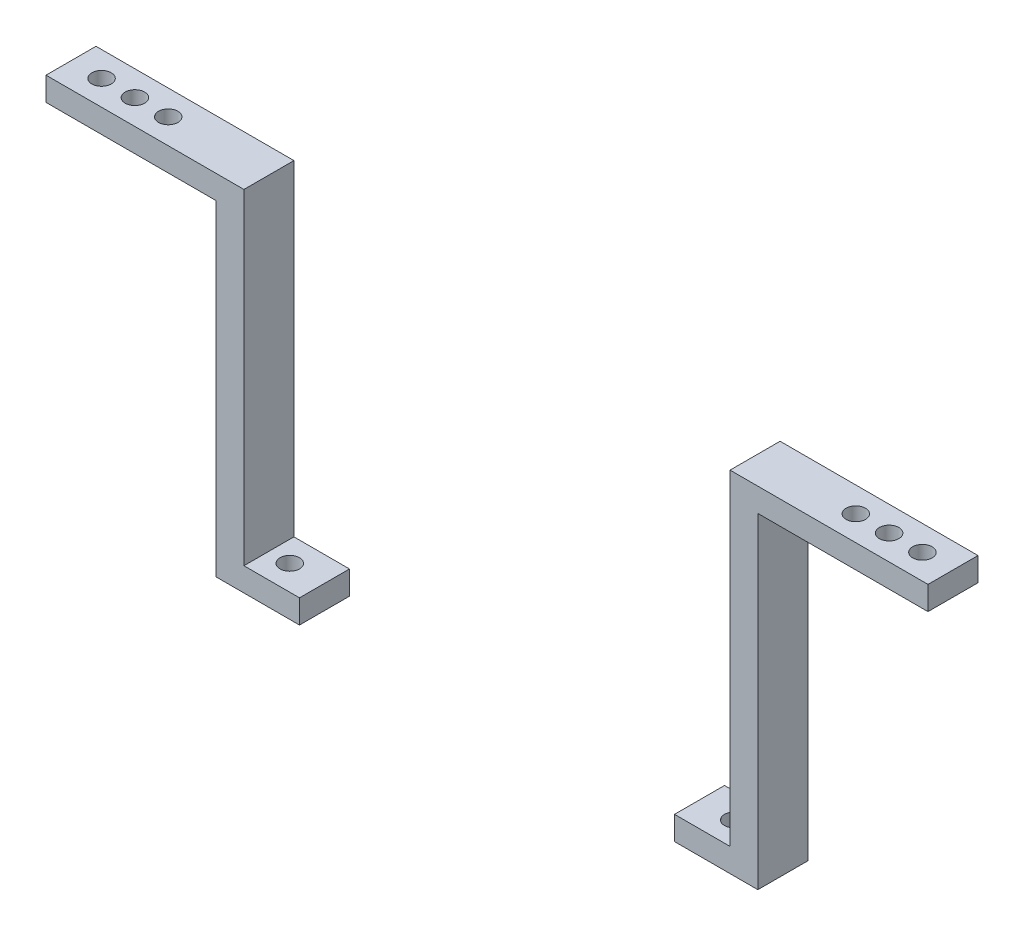
ISO-10303-21;
HEADER;
FILE_DESCRIPTION(('STEP AP214'),'2;1');
FILE_NAME('part.step','',(''),(''),'','','');
FILE_SCHEMA(('AUTOMOTIVE_DESIGN { 1 0 10303 214 1 1 1 1 }'));
ENDSEC;
DATA;
#1=APPLICATION_CONTEXT('core data for automotive mechanical design processes');
#2=APPLICATION_PROTOCOL_DEFINITION('international standard','automotive_design',2000,#1);
#3=PRODUCT_CONTEXT('',#1,'mechanical');
#4=PRODUCT('Part','Part','',(#3));
#5=PRODUCT_RELATED_PRODUCT_CATEGORY('part','',(#4));
#6=PRODUCT_DEFINITION_FORMATION('','',#4);
#7=PRODUCT_DEFINITION_CONTEXT('part definition',#1,'design');
#8=PRODUCT_DEFINITION('design','',#6,#7);
#9=PRODUCT_DEFINITION_SHAPE('','',#8);
#10=(LENGTH_UNIT() NAMED_UNIT(*) SI_UNIT(.MILLI.,.METRE.));
#11=(NAMED_UNIT(*) PLANE_ANGLE_UNIT() SI_UNIT($,.RADIAN.));
#12=(NAMED_UNIT(*) SI_UNIT($,.STERADIAN.) SOLID_ANGLE_UNIT());
#13=UNCERTAINTY_MEASURE_WITH_UNIT(LENGTH_MEASURE(1.E-05),#10,'distance_accuracy_value','');
#14=(GEOMETRIC_REPRESENTATION_CONTEXT(3) GLOBAL_UNCERTAINTY_ASSIGNED_CONTEXT((#13)) GLOBAL_UNIT_ASSIGNED_CONTEXT((#10,
#11,#12)) REPRESENTATION_CONTEXT('',''));
#15=CARTESIAN_POINT('',(0.,0.,0.));
#16=DIRECTION('',(0.,0.,1.));
#17=DIRECTION('',(1.,0.,0.));
#18=AXIS2_PLACEMENT_3D('',#15,#16,#17);
#19=CARTESIAN_POINT('',(0.,4.318,0.));
#20=DIRECTION('',(0.,1.,0.));
#21=DIRECTION('',(0.,0.,1.));
#22=AXIS2_PLACEMENT_3D('',#19,#20,#21);
#23=PLANE('',#22);
#24=DIRECTION('',(0.,0.,1.));
#25=VECTOR('',#24,1.);
#26=CARTESIAN_POINT('',(44.45,4.318,4.572));
#27=LINE('',#26,#25);
#28=CARTESIAN_POINT('',(44.45,4.318,-4.572));
#29=VERTEX_POINT('',#28);
#30=CARTESIAN_POINT('',(44.45,4.318,4.572));
#31=VERTEX_POINT('',#30);
#32=EDGE_CURVE('E60',#29,#31,#27,.T.);
#33=ORIENTED_EDGE('',*,*,#32,.F.);
#34=DIRECTION('',(-1.,0.,0.));
#35=VECTOR('',#34,1.);
#36=CARTESIAN_POINT('',(34.29,4.318,-4.572));
#37=LINE('',#36,#35);
#38=CARTESIAN_POINT('',(34.29,4.318,-4.572));
#39=VERTEX_POINT('',#38);
#40=EDGE_CURVE('E65',#29,#39,#37,.T.);
#41=ORIENTED_EDGE('',*,*,#40,.T.);
#42=DIRECTION('',(0.,0.,1.));
#43=VECTOR('',#42,1.);
#44=CARTESIAN_POINT('',(34.29,4.318,-4.572));
#45=LINE('',#44,#43);
#46=CARTESIAN_POINT('',(34.29,4.318,4.572));
#47=VERTEX_POINT('',#46);
#48=EDGE_CURVE('E96',#39,#47,#45,.T.);
#49=ORIENTED_EDGE('',*,*,#48,.T.);
#50=DIRECTION('',(1.,0.,0.));
#51=VECTOR('',#50,1.);
#52=CARTESIAN_POINT('',(34.29,4.318,4.572));
#53=LINE('',#52,#51);
#54=EDGE_CURVE('E118',#47,#31,#53,.T.);
#55=ORIENTED_EDGE('',*,*,#54,.T.);
#56=EDGE_LOOP('',(#33,#41,#49,#55));
#57=FACE_BOUND('',#56,.T.);
#58=CARTESIAN_POINT('',(40.64,4.318,0.));
#59=DIRECTION('',(0.,1.,0.));
#60=DIRECTION('',(0.,0.,1.));
#61=AXIS2_PLACEMENT_3D('',#58,#59,#60);
#62=CIRCLE('',#61,1.778);
#63=CARTESIAN_POINT('',(40.64,4.318,1.778));
#64=VERTEX_POINT('',#63);
#65=EDGE_CURVE('E107',#64,#64,#62,.T.);
#66=ORIENTED_EDGE('',*,*,#65,.F.);
#67=EDGE_LOOP('',(#66));
#68=FACE_BOUND('',#67,.T.);
#69=ADVANCED_FACE('F43',(#57,#68),#23,.T.);
#70=CARTESIAN_POINT('',(0.,0.,0.));
#71=DIRECTION('',(0.,1.,0.));
#72=DIRECTION('',(0.,0.,1.));
#73=AXIS2_PLACEMENT_3D('',#70,#71,#72);
#74=PLANE('',#73);
#75=DIRECTION('',(0.,0.,1.));
#76=VECTOR('',#75,1.);
#77=CARTESIAN_POINT('',(34.29,0.,-4.572));
#78=LINE('',#77,#76);
#79=CARTESIAN_POINT('',(34.29,0.,-4.572));
#80=VERTEX_POINT('',#79);
#81=CARTESIAN_POINT('',(34.29,0.,4.572));
#82=VERTEX_POINT('',#81);
#83=EDGE_CURVE('E102',#80,#82,#78,.T.);
#84=ORIENTED_EDGE('',*,*,#83,.F.);
#85=DIRECTION('',(-1.,0.,0.));
#86=VECTOR('',#85,1.);
#87=CARTESIAN_POINT('',(34.29,0.,-4.572));
#88=LINE('',#87,#86);
#89=CARTESIAN_POINT('',(49.53,0.,-4.572));
#90=VERTEX_POINT('',#89);
#91=EDGE_CURVE('E85',#90,#80,#88,.T.);
#92=ORIENTED_EDGE('',*,*,#91,.F.);
#93=DIRECTION('',(0.,0.,-1.));
#94=VECTOR('',#93,1.);
#95=CARTESIAN_POINT('',(49.53,0.,-4.572));
#96=LINE('',#95,#94);
#97=CARTESIAN_POINT('',(49.53,0.,4.572));
#98=VERTEX_POINT('',#97);
#99=EDGE_CURVE('E97',#98,#90,#96,.T.);
#100=ORIENTED_EDGE('',*,*,#99,.F.);
#101=DIRECTION('',(1.,0.,0.));
#102=VECTOR('',#101,1.);
#103=CARTESIAN_POINT('',(34.29,0.,4.572));
#104=LINE('',#103,#102);
#105=EDGE_CURVE('E106',#82,#98,#104,.T.);
#106=ORIENTED_EDGE('',*,*,#105,.F.);
#107=EDGE_LOOP('',(#84,#92,#100,#106));
#108=FACE_BOUND('',#107,.T.);
#109=CARTESIAN_POINT('',(40.64,0.,0.));
#110=DIRECTION('',(0.,1.,0.));
#111=DIRECTION('',(0.,0.,1.));
#112=AXIS2_PLACEMENT_3D('',#109,#110,#111);
#113=CIRCLE('',#112,1.778);
#114=CARTESIAN_POINT('',(40.64,0.,1.778));
#115=VERTEX_POINT('',#114);
#116=EDGE_CURVE('E111',#115,#115,#113,.T.);
#117=ORIENTED_EDGE('',*,*,#116,.T.);
#118=EDGE_LOOP('',(#117));
#119=FACE_BOUND('',#118,.T.);
#120=ADVANCED_FACE('F104',(#108,#119),#74,.F.);
#121=CARTESIAN_POINT('',(34.29,4.318,-4.572));
#122=DIRECTION('',(1.,0.,0.));
#123=DIRECTION('',(0.,0.,-1.));
#124=AXIS2_PLACEMENT_3D('',#121,#122,#123);
#125=PLANE('',#124);
#126=ORIENTED_EDGE('',*,*,#83,.T.);
#127=DIRECTION('',(0.,-1.,0.));
#128=VECTOR('',#127,1.);
#129=CARTESIAN_POINT('',(34.29,4.318,4.572));
#130=LINE('',#129,#128);
#131=EDGE_CURVE('E12',#47,#82,#130,.T.);
#132=ORIENTED_EDGE('',*,*,#131,.F.);
#133=ORIENTED_EDGE('',*,*,#48,.F.);
#134=DIRECTION('',(0.,-1.,0.));
#135=VECTOR('',#134,1.);
#136=CARTESIAN_POINT('',(34.29,4.318,-4.572));
#137=LINE('',#136,#135);
#138=EDGE_CURVE('E88',#39,#80,#137,.T.);
#139=ORIENTED_EDGE('',*,*,#138,.T.);
#140=EDGE_LOOP('',(#126,#132,#133,#139));
#141=FACE_BOUND('',#140,.T.);
#142=ADVANCED_FACE('F45',(#141),#125,.F.);
#143=CARTESIAN_POINT('',(34.29,4.318,4.572));
#144=DIRECTION('',(0.,0.,-1.));
#145=DIRECTION('',(-1.,0.,0.));
#146=AXIS2_PLACEMENT_3D('',#143,#144,#145);
#147=PLANE('',#146);
#148=ORIENTED_EDGE('',*,*,#105,.T.);
#149=DIRECTION('',(0.,-1.,0.));
#150=VECTOR('',#149,1.);
#151=CARTESIAN_POINT('',(49.53,4.318,4.572));
#152=LINE('',#151,#150);
#153=CARTESIAN_POINT('',(49.53,59.594,4.572));
#154=VERTEX_POINT('',#153);
#155=EDGE_CURVE('E52',#154,#98,#152,.T.);
#156=ORIENTED_EDGE('',*,*,#155,.F.);
#157=DIRECTION('',(1.,0.,0.));
#158=VECTOR('',#157,1.);
#159=CARTESIAN_POINT('',(44.45,59.594,4.572));
#160=LINE('',#159,#158);
#161=CARTESIAN_POINT('',(80.645,59.594,4.57199999999999));
#162=VERTEX_POINT('',#161);
#163=EDGE_CURVE('E154',#154,#162,#160,.T.);
#164=ORIENTED_EDGE('',*,*,#163,.T.);
#165=DIRECTION('',(0.,-1.,0.));
#166=VECTOR('',#165,1.);
#167=CARTESIAN_POINT('',(80.645,63.912,4.57199999999999));
#168=LINE('',#167,#166);
#169=CARTESIAN_POINT('',(80.645,63.912,4.57199999999999));
#170=VERTEX_POINT('',#169);
#171=EDGE_CURVE('E133',#170,#162,#168,.T.);
#172=ORIENTED_EDGE('',*,*,#171,.F.);
#173=DIRECTION('',(1.,0.,0.));
#174=VECTOR('',#173,1.);
#175=CARTESIAN_POINT('',(44.45,63.912,4.572));
#176=LINE('',#175,#174);
#177=CARTESIAN_POINT('',(44.45,63.912,4.572));
#178=VERTEX_POINT('',#177);
#179=EDGE_CURVE('E175',#178,#170,#176,.T.);
#180=ORIENTED_EDGE('',*,*,#179,.F.);
#181=DIRECTION('',(0.,-1.,0.));
#182=VECTOR('',#181,1.);
#183=CARTESIAN_POINT('',(44.45,59.594,4.572));
#184=LINE('',#183,#182);
#185=EDGE_CURVE('E134',#178,#31,#184,.T.);
#186=ORIENTED_EDGE('',*,*,#185,.T.);
#187=ORIENTED_EDGE('',*,*,#54,.F.);
#188=ORIENTED_EDGE('',*,*,#131,.T.);
#189=EDGE_LOOP('',(#148,#156,#164,#172,#180,#186,#187,#188));
#190=FACE_BOUND('',#189,.T.);
#191=ADVANCED_FACE('F228',(#190),#147,.F.);
#192=CARTESIAN_POINT('',(49.53,4.318,-4.572));
#193=DIRECTION('',(-1.,0.,0.));
#194=DIRECTION('',(0.,0.,1.));
#195=AXIS2_PLACEMENT_3D('',#192,#193,#194);
#196=PLANE('',#195);
#197=ORIENTED_EDGE('',*,*,#99,.T.);
#198=DIRECTION('',(0.,-1.,0.));
#199=VECTOR('',#198,1.);
#200=CARTESIAN_POINT('',(49.53,4.318,-4.572));
#201=LINE('',#200,#199);
#202=CARTESIAN_POINT('',(49.53,59.594,-4.572));
#203=VERTEX_POINT('',#202);
#204=EDGE_CURVE('E92',#203,#90,#201,.T.);
#205=ORIENTED_EDGE('',*,*,#204,.F.);
#206=DIRECTION('',(0.,0.,-1.));
#207=VECTOR('',#206,1.);
#208=CARTESIAN_POINT('',(49.53,59.594,4.572));
#209=LINE('',#208,#207);
#210=EDGE_CURVE('E132',#154,#203,#209,.T.);
#211=ORIENTED_EDGE('',*,*,#210,.F.);
#212=ORIENTED_EDGE('',*,*,#155,.T.);
#213=EDGE_LOOP('',(#197,#205,#211,#212));
#214=FACE_BOUND('',#213,.T.);
#215=ADVANCED_FACE('F229',(#214),#196,.F.);
#216=CARTESIAN_POINT('',(34.29,4.318,-4.572));
#217=DIRECTION('',(0.,0.,1.));
#218=DIRECTION('',(1.,0.,0.));
#219=AXIS2_PLACEMENT_3D('',#216,#217,#218);
#220=PLANE('',#219);
#221=ORIENTED_EDGE('',*,*,#91,.T.);
#222=ORIENTED_EDGE('',*,*,#138,.F.);
#223=ORIENTED_EDGE('',*,*,#40,.F.);
#224=DIRECTION('',(0.,-1.,0.));
#225=VECTOR('',#224,1.);
#226=CARTESIAN_POINT('',(44.45,59.594,-4.572));
#227=LINE('',#226,#225);
#228=CARTESIAN_POINT('',(44.45,63.912,-4.572));
#229=VERTEX_POINT('',#228);
#230=EDGE_CURVE('E125',#229,#29,#227,.T.);
#231=ORIENTED_EDGE('',*,*,#230,.F.);
#232=DIRECTION('',(-1.,0.,0.));
#233=VECTOR('',#232,1.);
#234=CARTESIAN_POINT('',(44.45,63.912,-4.572));
#235=LINE('',#234,#233);
#236=CARTESIAN_POINT('',(80.645,63.912,-4.57200000000001));
#237=VERTEX_POINT('',#236);
#238=EDGE_CURVE('E182',#237,#229,#235,.T.);
#239=ORIENTED_EDGE('',*,*,#238,.F.);
#240=DIRECTION('',(0.,-1.,0.));
#241=VECTOR('',#240,1.);
#242=CARTESIAN_POINT('',(80.645,63.912,-4.57200000000001));
#243=LINE('',#242,#241);
#244=CARTESIAN_POINT('',(80.645,59.594,-4.57200000000001));
#245=VERTEX_POINT('',#244);
#246=EDGE_CURVE('E185',#237,#245,#243,.T.);
#247=ORIENTED_EDGE('',*,*,#246,.T.);
#248=DIRECTION('',(-1.,0.,0.));
#249=VECTOR('',#248,1.);
#250=CARTESIAN_POINT('',(44.45,59.594,-4.572));
#251=LINE('',#250,#249);
#252=EDGE_CURVE('E176',#245,#203,#251,.T.);
#253=ORIENTED_EDGE('',*,*,#252,.T.);
#254=ORIENTED_EDGE('',*,*,#204,.T.);
#255=EDGE_LOOP('',(#221,#222,#223,#231,#239,#247,#253,#254));
#256=FACE_BOUND('',#255,.T.);
#257=ADVANCED_FACE('F87',(#256),#220,.F.);
#258=CARTESIAN_POINT('',(40.64,4.318,0.));
#259=DIRECTION('',(0.,-1.,0.));
#260=DIRECTION('',(0.,0.,-1.));
#261=AXIS2_PLACEMENT_3D('',#258,#259,#260);
#262=CYLINDRICAL_SURFACE('',#261,1.778);
#263=ORIENTED_EDGE('',*,*,#65,.T.);
#264=EDGE_LOOP('',(#263));
#265=FACE_BOUND('',#264,.T.);
#266=ORIENTED_EDGE('',*,*,#116,.F.);
#267=EDGE_LOOP('',(#266));
#268=FACE_BOUND('',#267,.T.);
#269=ADVANCED_FACE('F236',(#265,#268),#262,.F.);
#270=CARTESIAN_POINT('',(44.45,59.594,4.572));
#271=DIRECTION('',(1.,0.,0.));
#272=DIRECTION('',(0.,0.,-1.));
#273=AXIS2_PLACEMENT_3D('',#270,#271,#272);
#274=PLANE('',#273);
#275=ORIENTED_EDGE('',*,*,#32,.T.);
#276=ORIENTED_EDGE('',*,*,#185,.F.);
#277=DIRECTION('',(0.,0.,1.));
#278=VECTOR('',#277,1.);
#279=CARTESIAN_POINT('',(44.45,63.912,4.572));
#280=LINE('',#279,#278);
#281=EDGE_CURVE('E172',#229,#178,#280,.T.);
#282=ORIENTED_EDGE('',*,*,#281,.F.);
#283=ORIENTED_EDGE('',*,*,#230,.T.);
#284=EDGE_LOOP('',(#275,#276,#282,#283));
#285=FACE_BOUND('',#284,.T.);
#286=ADVANCED_FACE('F248',(#285),#274,.F.);
#287=CARTESIAN_POINT('',(80.645,63.912,4.57199999999999));
#288=DIRECTION('',(-1.,0.,0.));
#289=DIRECTION('',(0.,0.,1.));
#290=AXIS2_PLACEMENT_3D('',#287,#288,#289);
#291=PLANE('',#290);
#292=DIRECTION('',(0.,0.,-1.));
#293=VECTOR('',#292,1.);
#294=CARTESIAN_POINT('',(80.645,59.594,4.57199999999999));
#295=LINE('',#294,#293);
#296=EDGE_CURVE('E188',#162,#245,#295,.T.);
#297=ORIENTED_EDGE('',*,*,#296,.T.);
#298=ORIENTED_EDGE('',*,*,#246,.F.);
#299=DIRECTION('',(0.,0.,-1.));
#300=VECTOR('',#299,1.);
#301=CARTESIAN_POINT('',(80.645,63.912,4.57199999999999));
#302=LINE('',#301,#300);
#303=EDGE_CURVE('E179',#170,#237,#302,.T.);
#304=ORIENTED_EDGE('',*,*,#303,.F.);
#305=ORIENTED_EDGE('',*,*,#171,.T.);
#306=EDGE_LOOP('',(#297,#298,#304,#305));
#307=FACE_BOUND('',#306,.T.);
#308=ADVANCED_FACE('F207',(#307),#291,.F.);
#309=CARTESIAN_POINT('',(0.,63.912,0.));
#310=DIRECTION('',(0.,-1.,0.));
#311=DIRECTION('',(0.,0.,-1.));
#312=AXIS2_PLACEMENT_3D('',#309,#310,#311);
#313=PLANE('',#312);
#314=CARTESIAN_POINT('',(62.865,63.912,0.));
#315=DIRECTION('',(0.,1.,0.));
#316=DIRECTION('',(0.,0.,1.));
#317=AXIS2_PLACEMENT_3D('',#314,#315,#316);
#318=CIRCLE('',#317,1.77800000000001);
#319=CARTESIAN_POINT('',(62.865,63.912,1.77800000000001));
#320=VERTEX_POINT('',#319);
#321=EDGE_CURVE('E158',#320,#320,#318,.T.);
#322=ORIENTED_EDGE('',*,*,#321,.F.);
#323=EDGE_LOOP('',(#322));
#324=FACE_BOUND('',#323,.T.);
#325=CARTESIAN_POINT('',(68.961,63.912,0.));
#326=DIRECTION('',(0.,1.,0.));
#327=DIRECTION('',(0.,0.,1.));
#328=AXIS2_PLACEMENT_3D('',#325,#326,#327);
#329=CIRCLE('',#328,1.77800000000001);
#330=CARTESIAN_POINT('',(68.961,63.912,1.77800000000001));
#331=VERTEX_POINT('',#330);
#332=EDGE_CURVE('E163',#331,#331,#329,.T.);
#333=ORIENTED_EDGE('',*,*,#332,.F.);
#334=EDGE_LOOP('',(#333));
#335=FACE_BOUND('',#334,.T.);
#336=CARTESIAN_POINT('',(75.057,63.912,0.));
#337=DIRECTION('',(0.,1.,0.));
#338=DIRECTION('',(0.,0.,1.));
#339=AXIS2_PLACEMENT_3D('',#336,#337,#338);
#340=CIRCLE('',#339,1.77800000000001);
#341=CARTESIAN_POINT('',(75.057,63.912,1.77800000000001));
#342=VERTEX_POINT('',#341);
#343=EDGE_CURVE('E155',#342,#342,#340,.T.);
#344=ORIENTED_EDGE('',*,*,#343,.F.);
#345=EDGE_LOOP('',(#344));
#346=FACE_BOUND('',#345,.T.);
#347=ORIENTED_EDGE('',*,*,#281,.T.);
#348=ORIENTED_EDGE('',*,*,#179,.T.);
#349=ORIENTED_EDGE('',*,*,#303,.T.);
#350=ORIENTED_EDGE('',*,*,#238,.T.);
#351=EDGE_LOOP('',(#347,#348,#349,#350));
#352=FACE_BOUND('',#351,.T.);
#353=ADVANCED_FACE('F255',(#324,#335,#346,#352),#313,.F.);
#354=CARTESIAN_POINT('',(0.,59.594,0.));
#355=DIRECTION('',(0.,-1.,0.));
#356=DIRECTION('',(0.,0.,-1.));
#357=AXIS2_PLACEMENT_3D('',#354,#355,#356);
#358=PLANE('',#357);
#359=CARTESIAN_POINT('',(62.865,59.594,0.));
#360=DIRECTION('',(0.,-1.,0.));
#361=DIRECTION('',(0.,0.,-1.));
#362=AXIS2_PLACEMENT_3D('',#359,#360,#361);
#363=CIRCLE('',#362,1.77800000000001);
#364=CARTESIAN_POINT('',(62.865,59.594,-1.77800000000001));
#365=VERTEX_POINT('',#364);
#366=EDGE_CURVE('E47',#365,#365,#363,.T.);
#367=ORIENTED_EDGE('',*,*,#366,.F.);
#368=EDGE_LOOP('',(#367));
#369=FACE_BOUND('',#368,.T.);
#370=CARTESIAN_POINT('',(68.961,59.594,0.));
#371=DIRECTION('',(0.,-1.,0.));
#372=DIRECTION('',(0.,0.,-1.));
#373=AXIS2_PLACEMENT_3D('',#370,#371,#372);
#374=CIRCLE('',#373,1.77800000000001);
#375=CARTESIAN_POINT('',(68.961,59.594,-1.77800000000001));
#376=VERTEX_POINT('',#375);
#377=EDGE_CURVE('E156',#376,#376,#374,.T.);
#378=ORIENTED_EDGE('',*,*,#377,.F.);
#379=EDGE_LOOP('',(#378));
#380=FACE_BOUND('',#379,.T.);
#381=CARTESIAN_POINT('',(75.057,59.594,0.));
#382=DIRECTION('',(0.,-1.,0.));
#383=DIRECTION('',(0.,0.,-1.));
#384=AXIS2_PLACEMENT_3D('',#381,#382,#383);
#385=CIRCLE('',#384,1.77800000000001);
#386=CARTESIAN_POINT('',(75.057,59.594,-1.77800000000001));
#387=VERTEX_POINT('',#386);
#388=EDGE_CURVE('E152',#387,#387,#385,.T.);
#389=ORIENTED_EDGE('',*,*,#388,.F.);
#390=EDGE_LOOP('',(#389));
#391=FACE_BOUND('',#390,.T.);
#392=ORIENTED_EDGE('',*,*,#163,.F.);
#393=ORIENTED_EDGE('',*,*,#210,.T.);
#394=ORIENTED_EDGE('',*,*,#252,.F.);
#395=ORIENTED_EDGE('',*,*,#296,.F.);
#396=EDGE_LOOP('',(#392,#393,#394,#395));
#397=FACE_BOUND('',#396,.T.);
#398=ADVANCED_FACE('F214',(#369,#380,#391,#397),#358,.T.);
#399=CARTESIAN_POINT('',(75.057,-2.50000000007189E-05,0.));
#400=DIRECTION('',(0.,1.,0.));
#401=DIRECTION('',(0.,0.,1.));
#402=AXIS2_PLACEMENT_3D('',#399,#400,#401);
#403=CYLINDRICAL_SURFACE('',#402,1.77800000000001);
#404=ORIENTED_EDGE('',*,*,#388,.T.);
#405=EDGE_LOOP('',(#404));
#406=FACE_BOUND('',#405,.T.);
#407=ORIENTED_EDGE('',*,*,#343,.T.);
#408=EDGE_LOOP('',(#407));
#409=FACE_BOUND('',#408,.T.);
#410=ADVANCED_FACE('F258',(#406,#409),#403,.F.);
#411=CARTESIAN_POINT('',(68.961,-2.50000000007189E-05,0.));
#412=DIRECTION('',(0.,1.,0.));
#413=DIRECTION('',(0.,0.,1.));
#414=AXIS2_PLACEMENT_3D('',#411,#412,#413);
#415=CYLINDRICAL_SURFACE('',#414,1.77800000000001);
#416=ORIENTED_EDGE('',*,*,#377,.T.);
#417=EDGE_LOOP('',(#416));
#418=FACE_BOUND('',#417,.T.);
#419=ORIENTED_EDGE('',*,*,#332,.T.);
#420=EDGE_LOOP('',(#419));
#421=FACE_BOUND('',#420,.T.);
#422=ADVANCED_FACE('F265',(#418,#421),#415,.F.);
#423=CARTESIAN_POINT('',(62.865,-2.50000000007189E-05,0.));
#424=DIRECTION('',(0.,1.,0.));
#425=DIRECTION('',(0.,0.,1.));
#426=AXIS2_PLACEMENT_3D('',#423,#424,#425);
#427=CYLINDRICAL_SURFACE('',#426,1.77800000000001);
#428=ORIENTED_EDGE('',*,*,#366,.T.);
#429=EDGE_LOOP('',(#428));
#430=FACE_BOUND('',#429,.T.);
#431=ORIENTED_EDGE('',*,*,#321,.T.);
#432=EDGE_LOOP('',(#431));
#433=FACE_BOUND('',#432,.T.);
#434=ADVANCED_FACE('F269',(#430,#433),#427,.F.);
#435=CLOSED_SHELL('',(#69,#120,#142,#191,#215,#257,#269,#286,#308,#353,#398,#410,#422,#434));
#436=MANIFOLD_SOLID_BREP('B2',#435);
#437=CARTESIAN_POINT('',(0.,4.318,0.));
#438=DIRECTION('',(0.,1.,0.));
#439=DIRECTION('',(0.,0.,1.));
#440=AXIS2_PLACEMENT_3D('',#437,#438,#439);
#441=PLANE('',#440);
#442=DIRECTION('',(0.,0.,-1.));
#443=VECTOR('',#442,1.);
#444=CARTESIAN_POINT('',(-44.45,4.318,-4.572));
#445=LINE('',#444,#443);
#446=CARTESIAN_POINT('',(-44.45,4.318,4.572));
#447=VERTEX_POINT('',#446);
#448=CARTESIAN_POINT('',(-44.45,4.318,-4.572));
#449=VERTEX_POINT('',#448);
#450=EDGE_CURVE('E410',#447,#449,#445,.T.);
#451=ORIENTED_EDGE('',*,*,#450,.F.);
#452=DIRECTION('',(1.,0.,0.));
#453=VECTOR('',#452,1.);
#454=CARTESIAN_POINT('',(-49.53,4.318,4.572));
#455=LINE('',#454,#453);
#456=CARTESIAN_POINT('',(-34.29,4.318,4.572));
#457=VERTEX_POINT('',#456);
#458=EDGE_CURVE('E447',#447,#457,#455,.T.);
#459=ORIENTED_EDGE('',*,*,#458,.T.);
#460=DIRECTION('',(0.,0.,-1.));
#461=VECTOR('',#460,1.);
#462=CARTESIAN_POINT('',(-34.29,4.318,-4.572));
#463=LINE('',#462,#461);
#464=CARTESIAN_POINT('',(-34.29,4.318,-4.572));
#465=VERTEX_POINT('',#464);
#466=EDGE_CURVE('E416',#457,#465,#463,.T.);
#467=ORIENTED_EDGE('',*,*,#466,.T.);
#468=DIRECTION('',(-1.,0.,0.));
#469=VECTOR('',#468,1.);
#470=CARTESIAN_POINT('',(-49.53,4.318,-4.572));
#471=LINE('',#470,#469);
#472=EDGE_CURVE('E457',#465,#449,#471,.T.);
#473=ORIENTED_EDGE('',*,*,#472,.T.);
#474=EDGE_LOOP('',(#451,#459,#467,#473));
#475=FACE_BOUND('',#474,.T.);
#476=CARTESIAN_POINT('',(-40.64,4.318,0.));
#477=DIRECTION('',(0.,1.,0.));
#478=DIRECTION('',(0.,0.,1.));
#479=AXIS2_PLACEMENT_3D('',#476,#477,#478);
#480=CIRCLE('',#479,1.778);
#481=CARTESIAN_POINT('',(-40.64,4.318,1.778));
#482=VERTEX_POINT('',#481);
#483=EDGE_CURVE('E461',#482,#482,#480,.T.);
#484=ORIENTED_EDGE('',*,*,#483,.F.);
#485=EDGE_LOOP('',(#484));
#486=FACE_BOUND('',#485,.T.);
#487=ADVANCED_FACE('F393',(#475,#486),#441,.T.);
#488=CARTESIAN_POINT('',(0.,0.,0.));
#489=DIRECTION('',(0.,1.,0.));
#490=DIRECTION('',(0.,0.,1.));
#491=AXIS2_PLACEMENT_3D('',#488,#489,#490);
#492=PLANE('',#491);
#493=DIRECTION('',(0.,0.,1.));
#494=VECTOR('',#493,1.);
#495=CARTESIAN_POINT('',(-49.53,0.,-4.572));
#496=LINE('',#495,#494);
#497=CARTESIAN_POINT('',(-49.53,0.,-4.572));
#498=VERTEX_POINT('',#497);
#499=CARTESIAN_POINT('',(-49.53,0.,4.572));
#500=VERTEX_POINT('',#499);
#501=EDGE_CURVE('E453',#498,#500,#496,.T.);
#502=ORIENTED_EDGE('',*,*,#501,.F.);
#503=DIRECTION('',(-1.,0.,0.));
#504=VECTOR('',#503,1.);
#505=CARTESIAN_POINT('',(-49.53,0.,-4.572));
#506=LINE('',#505,#504);
#507=CARTESIAN_POINT('',(-34.29,0.,-4.572));
#508=VERTEX_POINT('',#507);
#509=EDGE_CURVE('E436',#508,#498,#506,.T.);
#510=ORIENTED_EDGE('',*,*,#509,.F.);
#511=DIRECTION('',(0.,0.,-1.));
#512=VECTOR('',#511,1.);
#513=CARTESIAN_POINT('',(-34.29,0.,-4.572));
#514=LINE('',#513,#512);
#515=CARTESIAN_POINT('',(-34.29,0.,4.572));
#516=VERTEX_POINT('',#515);
#517=EDGE_CURVE('E448',#516,#508,#514,.T.);
#518=ORIENTED_EDGE('',*,*,#517,.F.);
#519=DIRECTION('',(1.,0.,0.));
#520=VECTOR('',#519,1.);
#521=CARTESIAN_POINT('',(-49.53,0.,4.572));
#522=LINE('',#521,#520);
#523=EDGE_CURVE('E460',#500,#516,#522,.T.);
#524=ORIENTED_EDGE('',*,*,#523,.F.);
#525=EDGE_LOOP('',(#502,#510,#518,#524));
#526=FACE_BOUND('',#525,.T.);
#527=CARTESIAN_POINT('',(-40.64,0.,0.));
#528=DIRECTION('',(0.,1.,0.));
#529=DIRECTION('',(0.,0.,1.));
#530=AXIS2_PLACEMENT_3D('',#527,#528,#529);
#531=CIRCLE('',#530,1.778);
#532=CARTESIAN_POINT('',(-40.64,0.,1.778));
#533=VERTEX_POINT('',#532);
#534=EDGE_CURVE('E465',#533,#533,#531,.T.);
#535=ORIENTED_EDGE('',*,*,#534,.T.);
#536=EDGE_LOOP('',(#535));
#537=FACE_BOUND('',#536,.T.);
#538=ADVANCED_FACE('F458',(#526,#537),#492,.F.);
#539=CARTESIAN_POINT('',(-49.53,4.318,-4.572));
#540=DIRECTION('',(1.,0.,0.));
#541=DIRECTION('',(0.,0.,-1.));
#542=AXIS2_PLACEMENT_3D('',#539,#540,#541);
#543=PLANE('',#542);
#544=ORIENTED_EDGE('',*,*,#501,.T.);
#545=DIRECTION('',(0.,-1.,0.));
#546=VECTOR('',#545,1.);
#547=CARTESIAN_POINT('',(-49.53,4.318,4.572));
#548=LINE('',#547,#546);
#549=CARTESIAN_POINT('',(-49.53,59.594,4.572));
#550=VERTEX_POINT('',#549);
#551=EDGE_CURVE('E41',#550,#500,#548,.T.);
#552=ORIENTED_EDGE('',*,*,#551,.F.);
#553=DIRECTION('',(0.,0.,1.));
#554=VECTOR('',#553,1.);
#555=CARTESIAN_POINT('',(-49.53,59.594,-4.572));
#556=LINE('',#555,#554);
#557=CARTESIAN_POINT('',(-49.53,59.594,-4.572));
#558=VERTEX_POINT('',#557);
#559=EDGE_CURVE('E455',#558,#550,#556,.T.);
#560=ORIENTED_EDGE('',*,*,#559,.F.);
#561=DIRECTION('',(0.,-1.,0.));
#562=VECTOR('',#561,1.);
#563=CARTESIAN_POINT('',(-49.53,4.318,-4.572));
#564=LINE('',#563,#562);
#565=EDGE_CURVE('E440',#558,#498,#564,.T.);
#566=ORIENTED_EDGE('',*,*,#565,.T.);
#567=EDGE_LOOP('',(#544,#552,#560,#566));
#568=FACE_BOUND('',#567,.T.);
#569=ADVANCED_FACE('F395',(#568),#543,.F.);
#570=CARTESIAN_POINT('',(-49.53,4.318,4.572));
#571=DIRECTION('',(0.,0.,-1.));
#572=DIRECTION('',(-1.,0.,0.));
#573=AXIS2_PLACEMENT_3D('',#570,#571,#572);
#574=PLANE('',#573);
#575=ORIENTED_EDGE('',*,*,#523,.T.);
#576=DIRECTION('',(0.,-1.,0.));
#577=VECTOR('',#576,1.);
#578=CARTESIAN_POINT('',(-34.29,4.318,4.572));
#579=LINE('',#578,#577);
#580=EDGE_CURVE('E402',#457,#516,#579,.T.);
#581=ORIENTED_EDGE('',*,*,#580,.F.);
#582=ORIENTED_EDGE('',*,*,#458,.F.);
#583=DIRECTION('',(0.,-1.,0.));
#584=VECTOR('',#583,1.);
#585=CARTESIAN_POINT('',(-44.45,59.594,4.572));
#586=LINE('',#585,#584);
#587=CARTESIAN_POINT('',(-44.45,63.912,4.572));
#588=VERTEX_POINT('',#587);
#589=EDGE_CURVE('E493',#588,#447,#586,.T.);
#590=ORIENTED_EDGE('',*,*,#589,.F.);
#591=DIRECTION('',(1.,0.,0.));
#592=VECTOR('',#591,1.);
#593=CARTESIAN_POINT('',(-44.45,63.912,4.572));
#594=LINE('',#593,#592);
#595=CARTESIAN_POINT('',(-80.645,63.912,4.572));
#596=VERTEX_POINT('',#595);
#597=EDGE_CURVE('E523',#596,#588,#594,.T.);
#598=ORIENTED_EDGE('',*,*,#597,.F.);
#599=DIRECTION('',(0.,-1.,0.));
#600=VECTOR('',#599,1.);
#601=CARTESIAN_POINT('',(-80.645,63.912,4.572));
#602=LINE('',#601,#600);
#603=CARTESIAN_POINT('',(-80.645,59.594,4.572));
#604=VERTEX_POINT('',#603);
#605=EDGE_CURVE('E528',#596,#604,#602,.T.);
#606=ORIENTED_EDGE('',*,*,#605,.T.);
#607=DIRECTION('',(1.,0.,0.));
#608=VECTOR('',#607,1.);
#609=CARTESIAN_POINT('',(-44.45,59.594,4.572));
#610=LINE('',#609,#608);
#611=EDGE_CURVE('E517',#604,#550,#610,.T.);
#612=ORIENTED_EDGE('',*,*,#611,.T.);
#613=ORIENTED_EDGE('',*,*,#551,.T.);
#614=EDGE_LOOP('',(#575,#581,#582,#590,#598,#606,#612,#613));
#615=FACE_BOUND('',#614,.T.);
#616=ADVANCED_FACE('F560',(#615),#574,.F.);
#617=CARTESIAN_POINT('',(-34.29,4.318,-4.572));
#618=DIRECTION('',(-1.,0.,0.));
#619=DIRECTION('',(0.,0.,1.));
#620=AXIS2_PLACEMENT_3D('',#617,#618,#619);
#621=PLANE('',#620);
#622=ORIENTED_EDGE('',*,*,#517,.T.);
#623=DIRECTION('',(0.,-1.,0.));
#624=VECTOR('',#623,1.);
#625=CARTESIAN_POINT('',(-34.29,4.318,-4.572));
#626=LINE('',#625,#624);
#627=EDGE_CURVE('E443',#465,#508,#626,.T.);
#628=ORIENTED_EDGE('',*,*,#627,.F.);
#629=ORIENTED_EDGE('',*,*,#466,.F.);
#630=ORIENTED_EDGE('',*,*,#580,.T.);
#631=EDGE_LOOP('',(#622,#628,#629,#630));
#632=FACE_BOUND('',#631,.T.);
#633=ADVANCED_FACE('F568',(#632),#621,.F.);
#634=CARTESIAN_POINT('',(-49.53,4.318,-4.572));
#635=DIRECTION('',(0.,0.,1.));
#636=DIRECTION('',(1.,0.,0.));
#637=AXIS2_PLACEMENT_3D('',#634,#635,#636);
#638=PLANE('',#637);
#639=ORIENTED_EDGE('',*,*,#509,.T.);
#640=ORIENTED_EDGE('',*,*,#565,.F.);
#641=DIRECTION('',(-1.,0.,0.));
#642=VECTOR('',#641,1.);
#643=CARTESIAN_POINT('',(-44.45,59.594,-4.572));
#644=LINE('',#643,#642);
#645=CARTESIAN_POINT('',(-80.645,59.594,-4.572));
#646=VERTEX_POINT('',#645);
#647=EDGE_CURVE('E511',#558,#646,#644,.T.);
#648=ORIENTED_EDGE('',*,*,#647,.T.);
#649=DIRECTION('',(0.,-1.,0.));
#650=VECTOR('',#649,1.);
#651=CARTESIAN_POINT('',(-80.645,63.912,-4.572));
#652=LINE('',#651,#650);
#653=CARTESIAN_POINT('',(-80.645,63.912,-4.572));
#654=VERTEX_POINT('',#653);
#655=EDGE_CURVE('E494',#654,#646,#652,.T.);
#656=ORIENTED_EDGE('',*,*,#655,.F.);
#657=DIRECTION('',(-1.,0.,0.));
#658=VECTOR('',#657,1.);
#659=CARTESIAN_POINT('',(-44.45,63.912,-4.572));
#660=LINE('',#659,#658);
#661=CARTESIAN_POINT('',(-44.45,63.912,-4.572));
#662=VERTEX_POINT('',#661);
#663=EDGE_CURVE('E497',#662,#654,#660,.T.);
#664=ORIENTED_EDGE('',*,*,#663,.F.);
#665=DIRECTION('',(0.,-1.,0.));
#666=VECTOR('',#665,1.);
#667=CARTESIAN_POINT('',(-44.45,59.594,-4.572));
#668=LINE('',#667,#666);
#669=EDGE_CURVE('E490',#662,#449,#668,.T.);
#670=ORIENTED_EDGE('',*,*,#669,.T.);
#671=ORIENTED_EDGE('',*,*,#472,.F.);
#672=ORIENTED_EDGE('',*,*,#627,.T.);
#673=EDGE_LOOP('',(#639,#640,#648,#656,#664,#670,#671,#672));
#674=FACE_BOUND('',#673,.T.);
#675=ADVANCED_FACE('F438',(#674),#638,.F.);
#676=CARTESIAN_POINT('',(-40.64,4.318,0.));
#677=DIRECTION('',(0.,-1.,0.));
#678=DIRECTION('',(0.,0.,-1.));
#679=AXIS2_PLACEMENT_3D('',#676,#677,#678);
#680=CYLINDRICAL_SURFACE('',#679,1.778);
#681=ORIENTED_EDGE('',*,*,#483,.T.);
#682=EDGE_LOOP('',(#681));
#683=FACE_BOUND('',#682,.T.);
#684=ORIENTED_EDGE('',*,*,#534,.F.);
#685=EDGE_LOOP('',(#684));
#686=FACE_BOUND('',#685,.T.);
#687=ADVANCED_FACE('F575',(#683,#686),#680,.F.);
#688=CARTESIAN_POINT('',(-44.45,59.594,-4.572));
#689=DIRECTION('',(-1.,0.,0.));
#690=DIRECTION('',(0.,0.,1.));
#691=AXIS2_PLACEMENT_3D('',#688,#689,#690);
#692=PLANE('',#691);
#693=ORIENTED_EDGE('',*,*,#450,.T.);
#694=ORIENTED_EDGE('',*,*,#669,.F.);
#695=DIRECTION('',(0.,0.,-1.));
#696=VECTOR('',#695,1.);
#697=CARTESIAN_POINT('',(-44.45,63.912,4.572));
#698=LINE('',#697,#696);
#699=EDGE_CURVE('E548',#588,#662,#698,.T.);
#700=ORIENTED_EDGE('',*,*,#699,.F.);
#701=ORIENTED_EDGE('',*,*,#589,.T.);
#702=EDGE_LOOP('',(#693,#694,#700,#701));
#703=FACE_BOUND('',#702,.T.);
#704=ADVANCED_FACE('F487',(#703),#692,.F.);
#705=CARTESIAN_POINT('',(0.,59.594,0.));
#706=DIRECTION('',(0.,1.,0.));
#707=DIRECTION('',(0.,0.,1.));
#708=AXIS2_PLACEMENT_3D('',#705,#706,#707);
#709=PLANE('',#708);
#710=CARTESIAN_POINT('',(-68.961,59.594,0.));
#711=DIRECTION('',(0.,1.,0.));
#712=DIRECTION('',(0.,0.,1.));
#713=AXIS2_PLACEMENT_3D('',#710,#711,#712);
#714=CIRCLE('',#713,1.77800000000001);
#715=CARTESIAN_POINT('',(-68.961,59.594,1.77800000000001));
#716=VERTEX_POINT('',#715);
#717=EDGE_CURVE('E616',#716,#716,#714,.T.);
#718=ORIENTED_EDGE('',*,*,#717,.T.);
#719=EDGE_LOOP('',(#718));
#720=FACE_BOUND('',#719,.T.);
#721=CARTESIAN_POINT('',(-62.865,59.594,0.));
#722=DIRECTION('',(0.,1.,0.));
#723=DIRECTION('',(0.,0.,1.));
#724=AXIS2_PLACEMENT_3D('',#721,#722,#723);
#725=CIRCLE('',#724,1.778);
#726=CARTESIAN_POINT('',(-62.865,59.594,1.778));
#727=VERTEX_POINT('',#726);
#728=EDGE_CURVE('E618',#727,#727,#725,.T.);
#729=ORIENTED_EDGE('',*,*,#728,.T.);
#730=EDGE_LOOP('',(#729));
#731=FACE_BOUND('',#730,.T.);
#732=CARTESIAN_POINT('',(-75.057,59.594,0.));
#733=DIRECTION('',(0.,1.,0.));
#734=DIRECTION('',(0.,0.,1.));
#735=AXIS2_PLACEMENT_3D('',#732,#733,#734);
#736=CIRCLE('',#735,1.77800000000001);
#737=CARTESIAN_POINT('',(-75.057,59.594,1.77800000000001));
#738=VERTEX_POINT('',#737);
#739=EDGE_CURVE('E516',#738,#738,#736,.T.);
#740=ORIENTED_EDGE('',*,*,#739,.T.);
#741=EDGE_LOOP('',(#740));
#742=FACE_BOUND('',#741,.T.);
#743=ORIENTED_EDGE('',*,*,#647,.F.);
#744=ORIENTED_EDGE('',*,*,#559,.T.);
#745=ORIENTED_EDGE('',*,*,#611,.F.);
#746=DIRECTION('',(0.,0.,1.));
#747=VECTOR('',#746,1.);
#748=CARTESIAN_POINT('',(-80.645,59.594,4.572));
#749=LINE('',#748,#747);
#750=EDGE_CURVE('E515',#646,#604,#749,.T.);
#751=ORIENTED_EDGE('',*,*,#750,.F.);
#752=EDGE_LOOP('',(#743,#744,#745,#751));
#753=FACE_BOUND('',#752,.T.);
#754=ADVANCED_FACE('F544',(#720,#731,#742,#753),#709,.F.);
#755=CARTESIAN_POINT('',(-80.645,63.912,4.572));
#756=DIRECTION('',(1.,0.,0.));
#757=DIRECTION('',(0.,0.,-1.));
#758=AXIS2_PLACEMENT_3D('',#755,#756,#757);
#759=PLANE('',#758);
#760=ORIENTED_EDGE('',*,*,#750,.T.);
#761=ORIENTED_EDGE('',*,*,#605,.F.);
#762=DIRECTION('',(0.,0.,1.));
#763=VECTOR('',#762,1.);
#764=CARTESIAN_POINT('',(-80.645,63.912,4.572));
#765=LINE('',#764,#763);
#766=EDGE_CURVE('E540',#654,#596,#765,.T.);
#767=ORIENTED_EDGE('',*,*,#766,.F.);
#768=ORIENTED_EDGE('',*,*,#655,.T.);
#769=EDGE_LOOP('',(#760,#761,#767,#768));
#770=FACE_BOUND('',#769,.T.);
#771=ADVANCED_FACE('F535',(#770),#759,.F.);
#772=CARTESIAN_POINT('',(0.,63.912,0.));
#773=DIRECTION('',(0.,1.,0.));
#774=DIRECTION('',(0.,0.,1.));
#775=AXIS2_PLACEMENT_3D('',#772,#773,#774);
#776=PLANE('',#775);
#777=CARTESIAN_POINT('',(-68.961,63.912,0.));
#778=DIRECTION('',(0.,1.,0.));
#779=DIRECTION('',(0.,0.,1.));
#780=AXIS2_PLACEMENT_3D('',#777,#778,#779);
#781=CIRCLE('',#780,1.77800000000001);
#782=CARTESIAN_POINT('',(-68.961,63.912,1.77800000000001));
#783=VERTEX_POINT('',#782);
#784=EDGE_CURVE('E613',#783,#783,#781,.T.);
#785=ORIENTED_EDGE('',*,*,#784,.F.);
#786=EDGE_LOOP('',(#785));
#787=FACE_BOUND('',#786,.T.);
#788=CARTESIAN_POINT('',(-62.865,63.912,0.));
#789=DIRECTION('',(0.,1.,0.));
#790=DIRECTION('',(0.,0.,1.));
#791=AXIS2_PLACEMENT_3D('',#788,#789,#790);
#792=CIRCLE('',#791,1.778);
#793=CARTESIAN_POINT('',(-62.865,63.912,1.778));
#794=VERTEX_POINT('',#793);
#795=EDGE_CURVE('E624',#794,#794,#792,.T.);
#796=ORIENTED_EDGE('',*,*,#795,.F.);
#797=EDGE_LOOP('',(#796));
#798=FACE_BOUND('',#797,.T.);
#799=CARTESIAN_POINT('',(-75.057,63.912,0.));
#800=DIRECTION('',(0.,1.,0.));
#801=DIRECTION('',(0.,0.,1.));
#802=AXIS2_PLACEMENT_3D('',#799,#800,#801);
#803=CIRCLE('',#802,1.77800000000001);
#804=CARTESIAN_POINT('',(-75.057,63.912,1.77800000000001));
#805=VERTEX_POINT('',#804);
#806=EDGE_CURVE('E617',#805,#805,#803,.T.);
#807=ORIENTED_EDGE('',*,*,#806,.F.);
#808=EDGE_LOOP('',(#807));
#809=FACE_BOUND('',#808,.T.);
#810=ORIENTED_EDGE('',*,*,#699,.T.);
#811=ORIENTED_EDGE('',*,*,#663,.T.);
#812=ORIENTED_EDGE('',*,*,#766,.T.);
#813=ORIENTED_EDGE('',*,*,#597,.T.);
#814=EDGE_LOOP('',(#810,#811,#812,#813));
#815=FACE_BOUND('',#814,.T.);
#816=ADVANCED_FACE('F558',(#787,#798,#809,#815),#776,.T.);
#817=CARTESIAN_POINT('',(-75.057,-2.50000000007189E-05,0.));
#818=DIRECTION('',(0.,1.,0.));
#819=DIRECTION('',(0.,0.,1.));
#820=AXIS2_PLACEMENT_3D('',#817,#818,#819);
#821=CYLINDRICAL_SURFACE('',#820,1.77800000000001);
#822=ORIENTED_EDGE('',*,*,#806,.T.);
#823=EDGE_LOOP('',(#822));
#824=FACE_BOUND('',#823,.T.);
#825=ORIENTED_EDGE('',*,*,#739,.F.);
#826=EDGE_LOOP('',(#825));
#827=FACE_BOUND('',#826,.T.);
#828=ADVANCED_FACE('F596',(#824,#827),#821,.F.);
#829=CARTESIAN_POINT('',(-62.865,-2.50000000007189E-05,0.));
#830=DIRECTION('',(0.,1.,0.));
#831=DIRECTION('',(0.,0.,1.));
#832=AXIS2_PLACEMENT_3D('',#829,#830,#831);
#833=CYLINDRICAL_SURFACE('',#832,1.778);
#834=ORIENTED_EDGE('',*,*,#795,.T.);
#835=EDGE_LOOP('',(#834));
#836=FACE_BOUND('',#835,.T.);
#837=ORIENTED_EDGE('',*,*,#728,.F.);
#838=EDGE_LOOP('',(#837));
#839=FACE_BOUND('',#838,.T.);
#840=ADVANCED_FACE('F600',(#836,#839),#833,.F.);
#841=CARTESIAN_POINT('',(-68.961,-2.50000000007189E-05,0.));
#842=DIRECTION('',(0.,1.,0.));
#843=DIRECTION('',(0.,0.,1.));
#844=AXIS2_PLACEMENT_3D('',#841,#842,#843);
#845=CYLINDRICAL_SURFACE('',#844,1.77800000000001);
#846=ORIENTED_EDGE('',*,*,#784,.T.);
#847=EDGE_LOOP('',(#846));
#848=FACE_BOUND('',#847,.T.);
#849=ORIENTED_EDGE('',*,*,#717,.F.);
#850=EDGE_LOOP('',(#849));
#851=FACE_BOUND('',#850,.T.);
#852=ADVANCED_FACE('F604',(#848,#851),#845,.F.);
#853=CLOSED_SHELL('',(#487,#538,#569,#616,#633,#675,#687,#704,#754,#771,#816,#828,#840,#852));
#854=MANIFOLD_SOLID_BREP('B6',#853);
#855=ADVANCED_BREP_SHAPE_REPRESENTATION('',(#18,#436,#854),#14);
#856=SHAPE_DEFINITION_REPRESENTATION(#9,#855);
ENDSEC;
END-ISO-10303-21;
